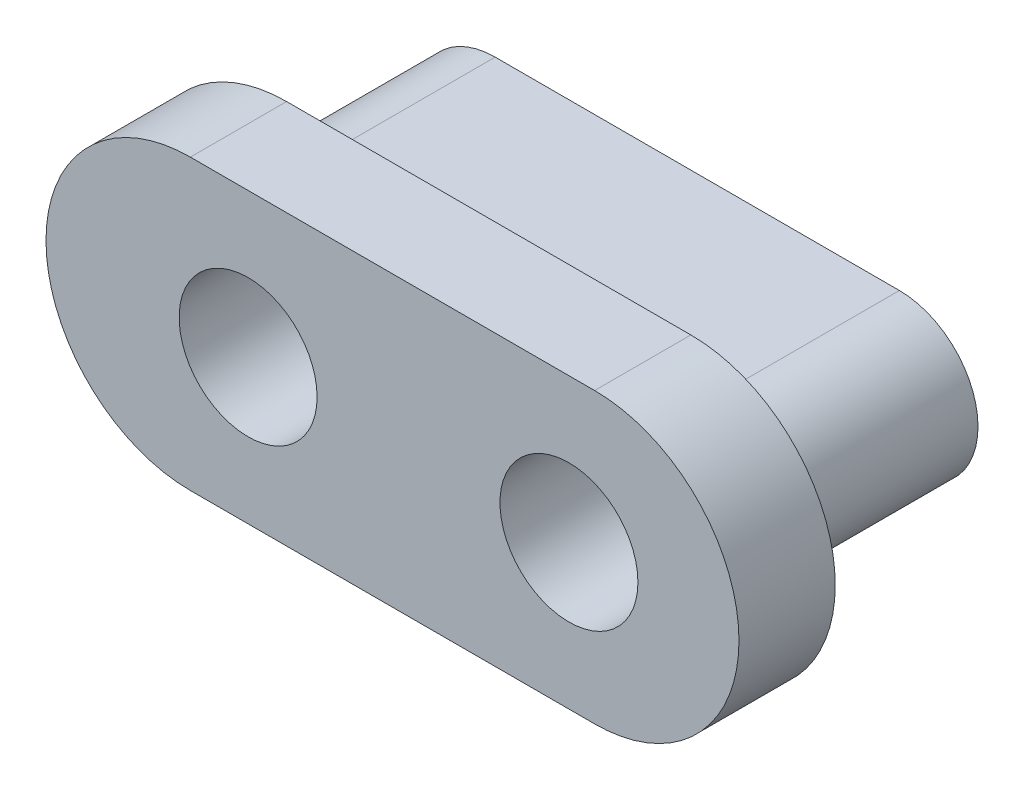
ISO-10303-21;
HEADER;
FILE_DESCRIPTION(('STEP AP214'),'2;1');
FILE_NAME('part.step','',(''),(''),'','','');
FILE_SCHEMA(('AUTOMOTIVE_DESIGN { 1 0 10303 214 1 1 1 1 }'));
ENDSEC;
DATA;
#1=APPLICATION_CONTEXT('core data for automotive mechanical design processes');
#2=APPLICATION_PROTOCOL_DEFINITION('international standard','automotive_design',2000,#1);
#3=PRODUCT_CONTEXT('',#1,'mechanical');
#4=PRODUCT('Part','Part','',(#3));
#5=PRODUCT_RELATED_PRODUCT_CATEGORY('part','',(#4));
#6=PRODUCT_DEFINITION_FORMATION('','',#4);
#7=PRODUCT_DEFINITION_CONTEXT('part definition',#1,'design');
#8=PRODUCT_DEFINITION('design','',#6,#7);
#9=PRODUCT_DEFINITION_SHAPE('','',#8);
#10=(LENGTH_UNIT() NAMED_UNIT(*) SI_UNIT(.MILLI.,.METRE.));
#11=(NAMED_UNIT(*) PLANE_ANGLE_UNIT() SI_UNIT($,.RADIAN.));
#12=(NAMED_UNIT(*) SI_UNIT($,.STERADIAN.) SOLID_ANGLE_UNIT());
#13=UNCERTAINTY_MEASURE_WITH_UNIT(LENGTH_MEASURE(1.E-05),#10,'distance_accuracy_value','');
#14=(GEOMETRIC_REPRESENTATION_CONTEXT(3) GLOBAL_UNCERTAINTY_ASSIGNED_CONTEXT((#13)) GLOBAL_UNIT_ASSIGNED_CONTEXT((#10,
#11,#12)) REPRESENTATION_CONTEXT('',''));
#15=CARTESIAN_POINT('',(0.,0.,0.));
#16=DIRECTION('',(0.,0.,1.));
#17=DIRECTION('',(1.,0.,0.));
#18=AXIS2_PLACEMENT_3D('',#15,#16,#17);
#19=CARTESIAN_POINT('',(-49.4979477432251,1.99999999999995,-6.5));
#20=DIRECTION('',(0.,0.,1.));
#21=DIRECTION('',(1.,0.,0.));
#22=AXIS2_PLACEMENT_3D('',#19,#20,#21);
#23=CYLINDRICAL_SURFACE('',#22,2.45);
#24=CARTESIAN_POINT('',(-49.4979477432251,1.99999999999995,0.));
#25=DIRECTION('',(0.,0.,1.));
#26=DIRECTION('',(1.,0.,0.));
#27=AXIS2_PLACEMENT_3D('',#24,#25,#26);
#28=CIRCLE('',#27,2.45);
#29=CARTESIAN_POINT('',(-49.4979477432251,4.44999999999995,0.));
#30=VERTEX_POINT('',#29);
#31=CARTESIAN_POINT('',(-49.4979477432251,-0.450000000000052,0.));
#32=VERTEX_POINT('',#31);
#33=EDGE_CURVE('E128',#30,#32,#28,.T.);
#34=ORIENTED_EDGE('',*,*,#33,.F.);
#35=DIRECTION('',(0.,0.,1.));
#36=VECTOR('',#35,1.);
#37=CARTESIAN_POINT('',(-49.4979477432251,4.44999999999995,-6.5));
#38=LINE('',#37,#36);
#39=CARTESIAN_POINT('',(-49.4979477432251,4.44999999999995,-6.5));
#40=VERTEX_POINT('',#39);
#41=EDGE_CURVE('E11',#40,#30,#38,.T.);
#42=ORIENTED_EDGE('',*,*,#41,.F.);
#43=CARTESIAN_POINT('',(-49.4979477432251,1.99999999999995,-6.5));
#44=DIRECTION('',(0.,0.,1.));
#45=DIRECTION('',(1.,0.,0.));
#46=AXIS2_PLACEMENT_3D('',#43,#44,#45);
#47=CIRCLE('',#46,2.45);
#48=CARTESIAN_POINT('',(-49.4979477432251,-0.450000000000052,-6.5));
#49=VERTEX_POINT('',#48);
#50=EDGE_CURVE('E137',#40,#49,#47,.T.);
#51=ORIENTED_EDGE('',*,*,#50,.T.);
#52=DIRECTION('',(0.,0.,1.));
#53=VECTOR('',#52,1.);
#54=CARTESIAN_POINT('',(-49.4979477432251,-0.450000000000052,-6.5));
#55=LINE('',#54,#53);
#56=EDGE_CURVE('E36',#49,#32,#55,.T.);
#57=ORIENTED_EDGE('',*,*,#56,.T.);
#58=EDGE_LOOP('',(#34,#42,#51,#57));
#59=FACE_BOUND('',#58,.T.);
#60=ADVANCED_FACE('F33',(#59),#23,.T.);
#61=CARTESIAN_POINT('',(-49.4979477432251,4.44999999999995,-6.5));
#62=DIRECTION('',(0.,1.,0.));
#63=DIRECTION('',(0.,0.,1.));
#64=AXIS2_PLACEMENT_3D('',#61,#62,#63);
#65=PLANE('',#64);
#66=DIRECTION('',(-1.,0.,0.));
#67=VECTOR('',#66,1.);
#68=CARTESIAN_POINT('',(-49.4979477432251,4.44999999999995,0.));
#69=LINE('',#68,#67);
#70=CARTESIAN_POINT('',(-36.8979477432251,4.44999999999995,0.));
#71=VERTEX_POINT('',#70);
#72=EDGE_CURVE('E140',#71,#30,#69,.T.);
#73=ORIENTED_EDGE('',*,*,#72,.F.);
#74=DIRECTION('',(0.,0.,1.));
#75=VECTOR('',#74,1.);
#76=CARTESIAN_POINT('',(-36.8979477432251,4.44999999999995,-6.5));
#77=LINE('',#76,#75);
#78=CARTESIAN_POINT('',(-36.8979477432251,4.44999999999995,-6.5));
#79=VERTEX_POINT('',#78);
#80=EDGE_CURVE('E42',#79,#71,#77,.T.);
#81=ORIENTED_EDGE('',*,*,#80,.F.);
#82=DIRECTION('',(-1.,0.,0.));
#83=VECTOR('',#82,1.);
#84=CARTESIAN_POINT('',(-49.4979477432251,4.44999999999995,-6.5));
#85=LINE('',#84,#83);
#86=EDGE_CURVE('E144',#79,#40,#85,.T.);
#87=ORIENTED_EDGE('',*,*,#86,.T.);
#88=ORIENTED_EDGE('',*,*,#41,.T.);
#89=EDGE_LOOP('',(#73,#81,#87,#88));
#90=FACE_BOUND('',#89,.T.);
#91=ADVANCED_FACE('F158',(#90),#65,.T.);
#92=CARTESIAN_POINT('',(-36.8979477432251,1.99999999999995,-6.5));
#93=DIRECTION('',(0.,0.,1.));
#94=DIRECTION('',(1.,0.,0.));
#95=AXIS2_PLACEMENT_3D('',#92,#93,#94);
#96=CYLINDRICAL_SURFACE('',#95,2.45);
#97=CARTESIAN_POINT('',(-36.8979477432251,1.99999999999995,0.));
#98=DIRECTION('',(0.,0.,1.));
#99=DIRECTION('',(1.,0.,0.));
#100=AXIS2_PLACEMENT_3D('',#97,#98,#99);
#101=CIRCLE('',#100,2.45);
#102=CARTESIAN_POINT('',(-36.8979477432251,-0.450000000000052,0.));
#103=VERTEX_POINT('',#102);
#104=EDGE_CURVE('E149',#103,#71,#101,.T.);
#105=ORIENTED_EDGE('',*,*,#104,.F.);
#106=DIRECTION('',(0.,0.,1.));
#107=VECTOR('',#106,1.);
#108=CARTESIAN_POINT('',(-36.8979477432251,-0.450000000000052,-6.5));
#109=LINE('',#108,#107);
#110=CARTESIAN_POINT('',(-36.8979477432251,-0.450000000000052,-6.5));
#111=VERTEX_POINT('',#110);
#112=EDGE_CURVE('E65',#111,#103,#109,.T.);
#113=ORIENTED_EDGE('',*,*,#112,.F.);
#114=CARTESIAN_POINT('',(-36.8979477432251,1.99999999999995,-6.5));
#115=DIRECTION('',(0.,0.,1.));
#116=DIRECTION('',(1.,0.,0.));
#117=AXIS2_PLACEMENT_3D('',#114,#115,#116);
#118=CIRCLE('',#117,2.45);
#119=EDGE_CURVE('E142',#111,#79,#118,.T.);
#120=ORIENTED_EDGE('',*,*,#119,.T.);
#121=ORIENTED_EDGE('',*,*,#80,.T.);
#122=EDGE_LOOP('',(#105,#113,#120,#121));
#123=FACE_BOUND('',#122,.T.);
#124=ADVANCED_FACE('F163',(#123),#96,.T.);
#125=CARTESIAN_POINT('',(-49.4979477432251,-0.450000000000052,-6.5));
#126=DIRECTION('',(0.,-1.,0.));
#127=DIRECTION('',(0.,0.,-1.));
#128=AXIS2_PLACEMENT_3D('',#125,#126,#127);
#129=PLANE('',#128);
#130=DIRECTION('',(1.,0.,0.));
#131=VECTOR('',#130,1.);
#132=CARTESIAN_POINT('',(-49.4979477432251,-0.450000000000052,0.));
#133=LINE('',#132,#131);
#134=EDGE_CURVE('E131',#32,#103,#133,.T.);
#135=ORIENTED_EDGE('',*,*,#134,.F.);
#136=ORIENTED_EDGE('',*,*,#56,.F.);
#137=DIRECTION('',(1.,0.,0.));
#138=VECTOR('',#137,1.);
#139=CARTESIAN_POINT('',(-49.4979477432251,-0.450000000000052,-6.5));
#140=LINE('',#139,#138);
#141=EDGE_CURVE('E139',#49,#111,#140,.T.);
#142=ORIENTED_EDGE('',*,*,#141,.T.);
#143=ORIENTED_EDGE('',*,*,#112,.T.);
#144=EDGE_LOOP('',(#135,#136,#142,#143));
#145=FACE_BOUND('',#144,.T.);
#146=ADVANCED_FACE('F154',(#145),#129,.T.);
#147=CARTESIAN_POINT('',(-49.4979477432251,1.99999999999995,-6.5));
#148=DIRECTION('',(0.,0.,1.));
#149=DIRECTION('',(1.,0.,0.));
#150=AXIS2_PLACEMENT_3D('',#147,#148,#149);
#151=PLANE('',#150);
#152=CARTESIAN_POINT('',(-47.6979477432251,1.99999999999995,-6.5));
#153=DIRECTION('',(0.,0.,1.));
#154=DIRECTION('',(1.,0.,0.));
#155=AXIS2_PLACEMENT_3D('',#152,#153,#154);
#156=CIRCLE('',#155,2.15);
#157=CARTESIAN_POINT('',(-45.5479477432251,1.99999999999995,-6.5));
#158=VERTEX_POINT('',#157);
#159=EDGE_CURVE('E278',#158,#158,#156,.T.);
#160=ORIENTED_EDGE('',*,*,#159,.T.);
#161=EDGE_LOOP('',(#160));
#162=FACE_BOUND('',#161,.T.);
#163=CARTESIAN_POINT('',(-37.6979477432251,1.99999999999995,-6.5));
#164=DIRECTION('',(0.,0.,1.));
#165=DIRECTION('',(1.,0.,0.));
#166=AXIS2_PLACEMENT_3D('',#163,#164,#165);
#167=CIRCLE('',#166,2.15);
#168=CARTESIAN_POINT('',(-35.5479477432251,1.99999999999995,-6.5));
#169=VERTEX_POINT('',#168);
#170=EDGE_CURVE('E288',#169,#169,#167,.T.);
#171=ORIENTED_EDGE('',*,*,#170,.T.);
#172=EDGE_LOOP('',(#171));
#173=FACE_BOUND('',#172,.T.);
#174=ORIENTED_EDGE('',*,*,#50,.F.);
#175=ORIENTED_EDGE('',*,*,#86,.F.);
#176=ORIENTED_EDGE('',*,*,#119,.F.);
#177=ORIENTED_EDGE('',*,*,#141,.F.);
#178=EDGE_LOOP('',(#174,#175,#176,#177));
#179=FACE_BOUND('',#178,.T.);
#180=ADVANCED_FACE('F162',(#162,#173,#179),#151,.F.);
#181=CARTESIAN_POINT('',(-49.4979477432251,1.99999999999995,0.));
#182=DIRECTION('',(0.,0.,1.));
#183=DIRECTION('',(1.,0.,0.));
#184=AXIS2_PLACEMENT_3D('',#181,#182,#183);
#185=PLANE('',#184);
#186=CARTESIAN_POINT('',(-49.4979477432251,1.99999999999995,0.));
#187=DIRECTION('',(0.,0.,1.));
#188=DIRECTION('',(1.,0.,0.));
#189=AXIS2_PLACEMENT_3D('',#186,#187,#188);
#190=CIRCLE('',#189,4.5);
#191=CARTESIAN_POINT('',(-49.4979477432251,6.49999999999995,0.));
#192=VERTEX_POINT('',#191);
#193=CARTESIAN_POINT('',(-49.4979477432251,-2.50000000000005,0.));
#194=VERTEX_POINT('',#193);
#195=EDGE_CURVE('E127',#192,#194,#190,.T.);
#196=ORIENTED_EDGE('',*,*,#195,.F.);
#197=DIRECTION('',(-1.,0.,0.));
#198=VECTOR('',#197,1.);
#199=CARTESIAN_POINT('',(-49.4979477432251,6.49999999999995,0.));
#200=LINE('',#199,#198);
#201=CARTESIAN_POINT('',(-36.8979477432251,6.49999999999995,0.));
#202=VERTEX_POINT('',#201);
#203=EDGE_CURVE('E123',#202,#192,#200,.T.);
#204=ORIENTED_EDGE('',*,*,#203,.F.);
#205=CARTESIAN_POINT('',(-36.8979477432251,1.99999999999995,0.));
#206=DIRECTION('',(0.,0.,1.));
#207=DIRECTION('',(1.,0.,0.));
#208=AXIS2_PLACEMENT_3D('',#205,#206,#207);
#209=CIRCLE('',#208,4.50000000000001);
#210=CARTESIAN_POINT('',(-36.8979477432251,-2.50000000000006,0.));
#211=VERTEX_POINT('',#210);
#212=EDGE_CURVE('E297',#211,#202,#209,.T.);
#213=ORIENTED_EDGE('',*,*,#212,.F.);
#214=DIRECTION('',(1.,0.,0.));
#215=VECTOR('',#214,1.);
#216=CARTESIAN_POINT('',(-49.4979477432251,-2.50000000000005,0.));
#217=LINE('',#216,#215);
#218=EDGE_CURVE('E295',#194,#211,#217,.T.);
#219=ORIENTED_EDGE('',*,*,#218,.F.);
#220=EDGE_LOOP('',(#196,#204,#213,#219));
#221=FACE_BOUND('',#220,.T.);
#222=ORIENTED_EDGE('',*,*,#72,.T.);
#223=ORIENTED_EDGE('',*,*,#33,.T.);
#224=ORIENTED_EDGE('',*,*,#134,.T.);
#225=ORIENTED_EDGE('',*,*,#104,.T.);
#226=EDGE_LOOP('',(#222,#223,#224,#225));
#227=FACE_BOUND('',#226,.T.);
#228=ADVANCED_FACE('F156',(#221,#227),#185,.F.);
#229=CARTESIAN_POINT('',(-49.4979477432251,1.99999999999995,3.));
#230=DIRECTION('',(0.,0.,-1.));
#231=DIRECTION('',(-1.,0.,0.));
#232=AXIS2_PLACEMENT_3D('',#229,#230,#231);
#233=CYLINDRICAL_SURFACE('',#232,4.5);
#234=ORIENTED_EDGE('',*,*,#195,.T.);
#235=DIRECTION('',(0.,0.,-1.));
#236=VECTOR('',#235,1.);
#237=CARTESIAN_POINT('',(-49.4979477432251,-2.50000000000005,3.));
#238=LINE('',#237,#236);
#239=CARTESIAN_POINT('',(-49.4979477432251,-2.50000000000005,3.));
#240=VERTEX_POINT('',#239);
#241=EDGE_CURVE('E107',#240,#194,#238,.T.);
#242=ORIENTED_EDGE('',*,*,#241,.F.);
#243=CARTESIAN_POINT('',(-49.4979477432251,1.99999999999995,3.));
#244=DIRECTION('',(0.,0.,1.));
#245=DIRECTION('',(1.,0.,0.));
#246=AXIS2_PLACEMENT_3D('',#243,#244,#245);
#247=CIRCLE('',#246,4.5);
#248=CARTESIAN_POINT('',(-49.4979477432251,6.49999999999995,3.));
#249=VERTEX_POINT('',#248);
#250=EDGE_CURVE('E114',#249,#240,#247,.T.);
#251=ORIENTED_EDGE('',*,*,#250,.F.);
#252=DIRECTION('',(0.,0.,-1.));
#253=VECTOR('',#252,1.);
#254=CARTESIAN_POINT('',(-49.4979477432251,6.49999999999995,3.));
#255=LINE('',#254,#253);
#256=EDGE_CURVE('E293',#249,#192,#255,.T.);
#257=ORIENTED_EDGE('',*,*,#256,.T.);
#258=EDGE_LOOP('',(#234,#242,#251,#257));
#259=FACE_BOUND('',#258,.T.);
#260=ADVANCED_FACE('F125',(#259),#233,.T.);
#261=CARTESIAN_POINT('',(-49.4979477432251,-2.50000000000005,3.));
#262=DIRECTION('',(0.,1.,0.));
#263=DIRECTION('',(-1.,0.,0.));
#264=AXIS2_PLACEMENT_3D('',#261,#262,#263);
#265=PLANE('',#264);
#266=ORIENTED_EDGE('',*,*,#218,.T.);
#267=DIRECTION('',(0.,0.,-1.));
#268=VECTOR('',#267,1.);
#269=CARTESIAN_POINT('',(-36.8979477432251,-2.50000000000006,3.));
#270=LINE('',#269,#268);
#271=CARTESIAN_POINT('',(-36.8979477432251,-2.50000000000006,3.));
#272=VERTEX_POINT('',#271);
#273=EDGE_CURVE('E110',#272,#211,#270,.T.);
#274=ORIENTED_EDGE('',*,*,#273,.F.);
#275=DIRECTION('',(1.,0.,0.));
#276=VECTOR('',#275,1.);
#277=CARTESIAN_POINT('',(-49.4979477432251,-2.50000000000005,3.));
#278=LINE('',#277,#276);
#279=EDGE_CURVE('E103',#240,#272,#278,.T.);
#280=ORIENTED_EDGE('',*,*,#279,.F.);
#281=ORIENTED_EDGE('',*,*,#241,.T.);
#282=EDGE_LOOP('',(#266,#274,#280,#281));
#283=FACE_BOUND('',#282,.T.);
#284=ADVANCED_FACE('F105',(#283),#265,.F.);
#285=CARTESIAN_POINT('',(-36.8979477432251,1.99999999999995,3.));
#286=DIRECTION('',(0.,0.,-1.));
#287=DIRECTION('',(-1.,0.,0.));
#288=AXIS2_PLACEMENT_3D('',#285,#286,#287);
#289=CYLINDRICAL_SURFACE('',#288,4.50000000000001);
#290=ORIENTED_EDGE('',*,*,#212,.T.);
#291=DIRECTION('',(0.,0.,-1.));
#292=VECTOR('',#291,1.);
#293=CARTESIAN_POINT('',(-36.8979477432251,6.49999999999995,3.));
#294=LINE('',#293,#292);
#295=CARTESIAN_POINT('',(-36.8979477432251,6.49999999999995,3.));
#296=VERTEX_POINT('',#295);
#297=EDGE_CURVE('E133',#296,#202,#294,.T.);
#298=ORIENTED_EDGE('',*,*,#297,.F.);
#299=CARTESIAN_POINT('',(-36.8979477432251,1.99999999999995,3.));
#300=DIRECTION('',(0.,0.,1.));
#301=DIRECTION('',(1.,0.,0.));
#302=AXIS2_PLACEMENT_3D('',#299,#300,#301);
#303=CIRCLE('',#302,4.50000000000001);
#304=EDGE_CURVE('E113',#272,#296,#303,.T.);
#305=ORIENTED_EDGE('',*,*,#304,.F.);
#306=ORIENTED_EDGE('',*,*,#273,.T.);
#307=EDGE_LOOP('',(#290,#298,#305,#306));
#308=FACE_BOUND('',#307,.T.);
#309=ADVANCED_FACE('F216',(#308),#289,.T.);
#310=CARTESIAN_POINT('',(-49.4979477432251,6.49999999999995,3.));
#311=DIRECTION('',(0.,-1.,0.));
#312=DIRECTION('',(1.,0.,0.));
#313=AXIS2_PLACEMENT_3D('',#310,#311,#312);
#314=PLANE('',#313);
#315=ORIENTED_EDGE('',*,*,#203,.T.);
#316=ORIENTED_EDGE('',*,*,#256,.F.);
#317=DIRECTION('',(-1.,0.,0.));
#318=VECTOR('',#317,1.);
#319=CARTESIAN_POINT('',(-49.4979477432251,6.49999999999995,3.));
#320=LINE('',#319,#318);
#321=EDGE_CURVE('E119',#296,#249,#320,.T.);
#322=ORIENTED_EDGE('',*,*,#321,.F.);
#323=ORIENTED_EDGE('',*,*,#297,.T.);
#324=EDGE_LOOP('',(#315,#316,#322,#323));
#325=FACE_BOUND('',#324,.T.);
#326=ADVANCED_FACE('F225',(#325),#314,.F.);
#327=CARTESIAN_POINT('',(-49.4979477432251,1.99999999999995,3.));
#328=DIRECTION('',(0.,0.,1.));
#329=DIRECTION('',(1.,0.,0.));
#330=AXIS2_PLACEMENT_3D('',#327,#328,#329);
#331=PLANE('',#330);
#332=CARTESIAN_POINT('',(-47.6979477432251,1.99999999999995,3.));
#333=DIRECTION('',(0.,0.,1.));
#334=DIRECTION('',(1.,0.,0.));
#335=AXIS2_PLACEMENT_3D('',#332,#333,#334);
#336=CIRCLE('',#335,2.15);
#337=CARTESIAN_POINT('',(-45.5479477432251,1.99999999999995,3.));
#338=VERTEX_POINT('',#337);
#339=EDGE_CURVE('E281',#338,#338,#336,.T.);
#340=ORIENTED_EDGE('',*,*,#339,.F.);
#341=EDGE_LOOP('',(#340));
#342=FACE_BOUND('',#341,.T.);
#343=CARTESIAN_POINT('',(-37.6979477432251,1.99999999999995,3.));
#344=DIRECTION('',(0.,0.,1.));
#345=DIRECTION('',(1.,0.,0.));
#346=AXIS2_PLACEMENT_3D('',#343,#344,#345);
#347=CIRCLE('',#346,2.15);
#348=CARTESIAN_POINT('',(-35.5479477432251,1.99999999999995,3.));
#349=VERTEX_POINT('',#348);
#350=EDGE_CURVE('E283',#349,#349,#347,.T.);
#351=ORIENTED_EDGE('',*,*,#350,.F.);
#352=EDGE_LOOP('',(#351));
#353=FACE_BOUND('',#352,.T.);
#354=ORIENTED_EDGE('',*,*,#250,.T.);
#355=ORIENTED_EDGE('',*,*,#279,.T.);
#356=ORIENTED_EDGE('',*,*,#304,.T.);
#357=ORIENTED_EDGE('',*,*,#321,.T.);
#358=EDGE_LOOP('',(#354,#355,#356,#357));
#359=FACE_BOUND('',#358,.T.);
#360=ADVANCED_FACE('F117',(#342,#353,#359),#331,.T.);
#361=CARTESIAN_POINT('',(-37.6979477432251,1.99999999999995,3.));
#362=DIRECTION('',(0.,0.,1.));
#363=DIRECTION('',(1.,0.,0.));
#364=AXIS2_PLACEMENT_3D('',#361,#362,#363);
#365=CYLINDRICAL_SURFACE('',#364,2.15);
#366=ORIENTED_EDGE('',*,*,#170,.F.);
#367=EDGE_LOOP('',(#366));
#368=FACE_BOUND('',#367,.T.);
#369=ORIENTED_EDGE('',*,*,#350,.T.);
#370=EDGE_LOOP('',(#369));
#371=FACE_BOUND('',#370,.T.);
#372=ADVANCED_FACE('F251',(#368,#371),#365,.F.);
#373=CARTESIAN_POINT('',(-47.6979477432251,1.99999999999995,3.));
#374=DIRECTION('',(0.,0.,1.));
#375=DIRECTION('',(1.,0.,0.));
#376=AXIS2_PLACEMENT_3D('',#373,#374,#375);
#377=CYLINDRICAL_SURFACE('',#376,2.15);
#378=ORIENTED_EDGE('',*,*,#159,.F.);
#379=EDGE_LOOP('',(#378));
#380=FACE_BOUND('',#379,.T.);
#381=ORIENTED_EDGE('',*,*,#339,.T.);
#382=EDGE_LOOP('',(#381));
#383=FACE_BOUND('',#382,.T.);
#384=ADVANCED_FACE('F261',(#380,#383),#377,.F.);
#385=CLOSED_SHELL('',(#60,#91,#124,#146,#180,#228,#260,#284,#309,#326,#360,#372,#384));
#386=MANIFOLD_SOLID_BREP('B2',#385);
#387=ADVANCED_BREP_SHAPE_REPRESENTATION('',(#18,#386),#14);
#388=SHAPE_DEFINITION_REPRESENTATION(#9,#387);
ENDSEC;
END-ISO-10303-21;
